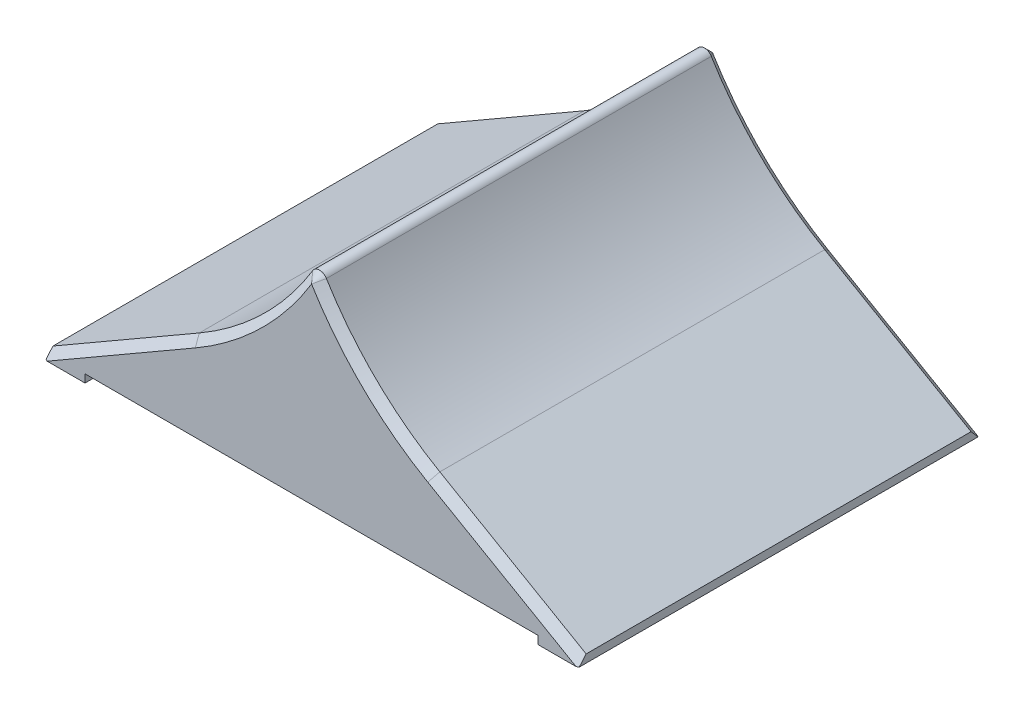
ISO-10303-21;
HEADER;
FILE_DESCRIPTION(('STEP AP214'),'2;1');
FILE_NAME('part.step','',(''),(''),'','','');
FILE_SCHEMA(('AUTOMOTIVE_DESIGN { 1 0 10303 214 1 1 1 1 }'));
ENDSEC;
DATA;
#1=APPLICATION_CONTEXT('core data for automotive mechanical design processes');
#2=APPLICATION_PROTOCOL_DEFINITION('international standard','automotive_design',2000,#1);
#3=PRODUCT_CONTEXT('',#1,'mechanical');
#4=PRODUCT('Part','Part','',(#3));
#5=PRODUCT_RELATED_PRODUCT_CATEGORY('part','',(#4));
#6=PRODUCT_DEFINITION_FORMATION('','',#4);
#7=PRODUCT_DEFINITION_CONTEXT('part definition',#1,'design');
#8=PRODUCT_DEFINITION('design','',#6,#7);
#9=PRODUCT_DEFINITION_SHAPE('','',#8);
#10=(LENGTH_UNIT() NAMED_UNIT(*) SI_UNIT(.MILLI.,.METRE.));
#11=(NAMED_UNIT(*) PLANE_ANGLE_UNIT() SI_UNIT($,.RADIAN.));
#12=(NAMED_UNIT(*) SI_UNIT($,.STERADIAN.) SOLID_ANGLE_UNIT());
#13=UNCERTAINTY_MEASURE_WITH_UNIT(LENGTH_MEASURE(1.E-05),#10,'distance_accuracy_value','');
#14=(GEOMETRIC_REPRESENTATION_CONTEXT(3) GLOBAL_UNCERTAINTY_ASSIGNED_CONTEXT((#13)) GLOBAL_UNIT_ASSIGNED_CONTEXT((#10,
#11,#12)) REPRESENTATION_CONTEXT('',''));
#15=CARTESIAN_POINT('',(0.,0.,0.));
#16=DIRECTION('',(0.,0.,1.));
#17=DIRECTION('',(1.,0.,0.));
#18=AXIS2_PLACEMENT_3D('',#15,#16,#17);
#19=CARTESIAN_POINT('',(-33.25,1.,-95.9820840390313));
#20=DIRECTION('',(0.,-1.,0.));
#21=DIRECTION('',(0.,0.,-1.));
#22=AXIS2_PLACEMENT_3D('',#19,#20,#21);
#23=PLANE('',#22);
#24=DIRECTION('',(-1.,0.,0.));
#25=VECTOR('',#24,1.);
#26=CARTESIAN_POINT('',(-33.25,1.,-25.));
#27=LINE('',#26,#25);
#28=CARTESIAN_POINT('',(28.25,1.,-25.));
#29=VERTEX_POINT('',#28);
#30=CARTESIAN_POINT('',(-28.25,1.,-25.));
#31=VERTEX_POINT('',#30);
#32=EDGE_CURVE('E206',#29,#31,#27,.T.);
#33=ORIENTED_EDGE('',*,*,#32,.F.);
#34=DIRECTION('',(0.,0.,1.));
#35=VECTOR('',#34,1.);
#36=CARTESIAN_POINT('',(28.25,1.,-25.));
#37=LINE('',#36,#35);
#38=CARTESIAN_POINT('',(28.25,1.,-15.));
#39=VERTEX_POINT('',#38);
#40=EDGE_CURVE('E216',#29,#39,#37,.T.);
#41=ORIENTED_EDGE('',*,*,#40,.T.);
#42=DIRECTION('',(0.707106781186548,0.,0.707106781186548));
#43=VECTOR('',#42,1.);
#44=CARTESIAN_POINT('',(28.25,1.,-15.));
#45=LINE('',#44,#43);
#46=CARTESIAN_POINT('',(31.25,1.,-12.));
#47=VERTEX_POINT('',#46);
#48=EDGE_CURVE('E222',#39,#47,#45,.T.);
#49=ORIENTED_EDGE('',*,*,#48,.T.);
#50=DIRECTION('',(0.,0.,1.));
#51=VECTOR('',#50,1.);
#52=CARTESIAN_POINT('',(31.25,1.,-12.));
#53=LINE('',#52,#51);
#54=CARTESIAN_POINT('',(31.25,1.,12.));
#55=VERTEX_POINT('',#54);
#56=EDGE_CURVE('E442',#47,#55,#53,.T.);
#57=ORIENTED_EDGE('',*,*,#56,.T.);
#58=DIRECTION('',(-0.707106781186548,0.,0.707106781186548));
#59=VECTOR('',#58,1.);
#60=CARTESIAN_POINT('',(31.25,1.,12.));
#61=LINE('',#60,#59);
#62=CARTESIAN_POINT('',(28.25,1.,15.));
#63=VERTEX_POINT('',#62);
#64=EDGE_CURVE('E439',#55,#63,#61,.T.);
#65=ORIENTED_EDGE('',*,*,#64,.T.);
#66=DIRECTION('',(0.,0.,1.));
#67=VECTOR('',#66,1.);
#68=CARTESIAN_POINT('',(28.25,1.,15.));
#69=LINE('',#68,#67);
#70=CARTESIAN_POINT('',(28.25,1.,25.));
#71=VERTEX_POINT('',#70);
#72=EDGE_CURVE('E421',#63,#71,#69,.T.);
#73=ORIENTED_EDGE('',*,*,#72,.T.);
#74=DIRECTION('',(1.,0.,0.));
#75=VECTOR('',#74,1.);
#76=CARTESIAN_POINT('',(-33.25,1.,25.));
#77=LINE('',#76,#75);
#78=CARTESIAN_POINT('',(-28.25,1.,25.));
#79=VERTEX_POINT('',#78);
#80=EDGE_CURVE('E212',#79,#71,#77,.T.);
#81=ORIENTED_EDGE('',*,*,#80,.F.);
#82=DIRECTION('',(0.,0.,-1.));
#83=VECTOR('',#82,1.);
#84=CARTESIAN_POINT('',(-28.25,1.,15.));
#85=LINE('',#84,#83);
#86=CARTESIAN_POINT('',(-28.25,1.,15.));
#87=VERTEX_POINT('',#86);
#88=EDGE_CURVE('E245',#79,#87,#85,.T.);
#89=ORIENTED_EDGE('',*,*,#88,.T.);
#90=DIRECTION('',(-0.707106781186548,0.,-0.707106781186548));
#91=VECTOR('',#90,1.);
#92=CARTESIAN_POINT('',(-31.25,1.,12.));
#93=LINE('',#92,#91);
#94=CARTESIAN_POINT('',(-31.25,1.,12.));
#95=VERTEX_POINT('',#94);
#96=EDGE_CURVE('E249',#87,#95,#93,.T.);
#97=ORIENTED_EDGE('',*,*,#96,.T.);
#98=DIRECTION('',(0.,0.,-1.));
#99=VECTOR('',#98,1.);
#100=CARTESIAN_POINT('',(-31.25,1.,-12.));
#101=LINE('',#100,#99);
#102=CARTESIAN_POINT('',(-31.25,1.,-12.));
#103=VERTEX_POINT('',#102);
#104=EDGE_CURVE('E252',#95,#103,#101,.T.);
#105=ORIENTED_EDGE('',*,*,#104,.T.);
#106=DIRECTION('',(0.707106781186548,0.,-0.707106781186548));
#107=VECTOR('',#106,1.);
#108=CARTESIAN_POINT('',(-28.25,1.,-15.));
#109=LINE('',#108,#107);
#110=CARTESIAN_POINT('',(-28.25,1.,-15.));
#111=VERTEX_POINT('',#110);
#112=EDGE_CURVE('E255',#103,#111,#109,.T.);
#113=ORIENTED_EDGE('',*,*,#112,.T.);
#114=DIRECTION('',(0.,0.,-1.));
#115=VECTOR('',#114,1.);
#116=CARTESIAN_POINT('',(-28.25,1.,-25.));
#117=LINE('',#116,#115);
#118=EDGE_CURVE('E228',#111,#31,#117,.T.);
#119=ORIENTED_EDGE('',*,*,#118,.T.);
#120=EDGE_LOOP('',(#33,#41,#49,#57,#65,#73,#81,#89,#97,#105,#113,#119));
#121=FACE_BOUND('',#120,.T.);
#122=ADVANCED_FACE('F35',(#121),#23,.T.);
#123=CARTESIAN_POINT('',(-33.25,1.,-25.));
#124=DIRECTION('',(0.,0.,1.));
#125=DIRECTION('',(1.,0.,0.));
#126=AXIS2_PLACEMENT_3D('',#123,#124,#125);
#127=PLANE('',#126);
#128=CARTESIAN_POINT('',(35.0000000000001,46.1776585640883,-25.));
#129=DIRECTION('',(0.,0.,1.));
#130=DIRECTION('',(1.,0.,0.));
#131=AXIS2_PLACEMENT_3D('',#128,#129,#130);
#132=CIRCLE('',#131,41.0000000000001);
#133=CARTESIAN_POINT('',(0.,24.8235020600258,-25.));
#134=VERTEX_POINT('',#133);
#135=CARTESIAN_POINT('',(14.5,10.6706170089263,-25.));
#136=VERTEX_POINT('',#135);
#137=EDGE_CURVE('E45',#134,#136,#132,.T.);
#138=ORIENTED_EDGE('',*,*,#137,.T.);
#139=DIRECTION('',(0.866025403784438,-0.500000000000002,0.));
#140=VECTOR('',#139,1.);
#141=CARTESIAN_POINT('',(32.75,0.133974596215555,-25.));
#142=LINE('',#141,#140);
#143=CARTESIAN_POINT('',(32.9820508075689,0.,-25.));
#144=VERTEX_POINT('',#143);
#145=EDGE_CURVE('E11',#136,#144,#142,.T.);
#146=ORIENTED_EDGE('',*,*,#145,.T.);
#147=DIRECTION('',(-1.,0.,0.));
#148=VECTOR('',#147,1.);
#149=CARTESIAN_POINT('',(33.25,0.,-25.));
#150=LINE('',#149,#148);
#151=CARTESIAN_POINT('',(28.25,0.,-25.));
#152=VERTEX_POINT('',#151);
#153=EDGE_CURVE('E209',#144,#152,#150,.T.);
#154=ORIENTED_EDGE('',*,*,#153,.T.);
#155=DIRECTION('',(0.,-1.,0.));
#156=VECTOR('',#155,1.);
#157=CARTESIAN_POINT('',(28.25,1.,-25.));
#158=LINE('',#157,#156);
#159=EDGE_CURVE('E201',#29,#152,#158,.T.);
#160=ORIENTED_EDGE('',*,*,#159,.F.);
#161=ORIENTED_EDGE('',*,*,#32,.T.);
#162=DIRECTION('',(0.,-1.,0.));
#163=VECTOR('',#162,1.);
#164=CARTESIAN_POINT('',(-28.25,1.,-25.));
#165=LINE('',#164,#163);
#166=CARTESIAN_POINT('',(-28.25,0.,-25.));
#167=VERTEX_POINT('',#166);
#168=EDGE_CURVE('E257',#31,#167,#165,.T.);
#169=ORIENTED_EDGE('',*,*,#168,.T.);
#170=DIRECTION('',(-1.,0.,0.));
#171=VECTOR('',#170,1.);
#172=CARTESIAN_POINT('',(-33.25,0.,-25.));
#173=LINE('',#172,#171);
#174=CARTESIAN_POINT('',(-32.9820508075689,0.,-25.));
#175=VERTEX_POINT('',#174);
#176=EDGE_CURVE('E229',#167,#175,#173,.T.);
#177=ORIENTED_EDGE('',*,*,#176,.T.);
#178=DIRECTION('',(0.866025403784438,0.500000000000001,0.));
#179=VECTOR('',#178,1.);
#180=CARTESIAN_POINT('',(-14.5,10.6706170089263,-25.));
#181=LINE('',#180,#179);
#182=CARTESIAN_POINT('',(-14.5,10.6706170089263,-25.));
#183=VERTEX_POINT('',#182);
#184=EDGE_CURVE('E334',#175,#183,#181,.T.);
#185=ORIENTED_EDGE('',*,*,#184,.T.);
#186=CARTESIAN_POINT('',(-35.0000000000001,46.1776585640882,-25.));
#187=DIRECTION('',(0.,0.,1.));
#188=DIRECTION('',(1.,0.,0.));
#189=AXIS2_PLACEMENT_3D('',#186,#187,#188);
#190=CIRCLE('',#189,41.);
#191=EDGE_CURVE('E56',#183,#134,#190,.T.);
#192=ORIENTED_EDGE('',*,*,#191,.T.);
#193=EDGE_LOOP('',(#138,#146,#154,#160,#161,#169,#177,#185,#192));
#194=FACE_BOUND('',#193,.T.);
#195=ADVANCED_FACE('F203',(#194),#127,.F.);
#196=CARTESIAN_POINT('',(-33.25,1.,25.));
#197=DIRECTION('',(1.,0.,0.));
#198=DIRECTION('',(0.,0.,-1.));
#199=AXIS2_PLACEMENT_3D('',#196,#197,#198);
#200=PLANE('',#199);
#201=DIRECTION('',(0.,0.,1.));
#202=VECTOR('',#201,1.);
#203=CARTESIAN_POINT('',(-33.25,0.,25.));
#204=LINE('',#203,#202);
#205=CARTESIAN_POINT('',(-33.25,0.,-24.8660254037844));
#206=VERTEX_POINT('',#205);
#207=CARTESIAN_POINT('',(-33.25,0.,24.8660254037844));
#208=VERTEX_POINT('',#207);
#209=EDGE_CURVE('E233',#206,#208,#204,.T.);
#210=ORIENTED_EDGE('',*,*,#209,.T.);
#211=DIRECTION('',(0.,0.755928946018452,-0.65465367070798));
#212=VECTOR('',#211,1.);
#213=CARTESIAN_POINT('',(-33.25,1.24743582965268,23.7857142857143));
#214=LINE('',#213,#212);
#215=CARTESIAN_POINT('',(-33.25,1.,24.));
#216=VERTEX_POINT('',#215);
#217=EDGE_CURVE('E323',#208,#216,#214,.T.);
#218=ORIENTED_EDGE('',*,*,#217,.T.);
#219=DIRECTION('',(0.,0.,1.));
#220=VECTOR('',#219,1.);
#221=CARTESIAN_POINT('',(-33.25,1.,25.));
#222=LINE('',#221,#220);
#223=CARTESIAN_POINT('',(-33.25,1.,-24.));
#224=VERTEX_POINT('',#223);
#225=EDGE_CURVE('E242',#224,#216,#222,.T.);
#226=ORIENTED_EDGE('',*,*,#225,.F.);
#227=DIRECTION('',(0.,-0.755928946018451,-0.654653670707981));
#228=VECTOR('',#227,1.);
#229=CARTESIAN_POINT('',(-33.25,0.0102566813892004,-24.8571428571429));
#230=LINE('',#229,#228);
#231=EDGE_CURVE('E321',#224,#206,#230,.T.);
#232=ORIENTED_EDGE('',*,*,#231,.T.);
#233=EDGE_LOOP('',(#210,#218,#226,#232));
#234=FACE_BOUND('',#233,.T.);
#235=ADVANCED_FACE('F375',(#234),#200,.F.);
#236=CARTESIAN_POINT('',(-28.25,1.,25.));
#237=DIRECTION('',(0.,0.,-1.));
#238=DIRECTION('',(-1.,0.,0.));
#239=AXIS2_PLACEMENT_3D('',#236,#237,#238);
#240=PLANE('',#239);
#241=DIRECTION('',(1.,0.,0.));
#242=VECTOR('',#241,1.);
#243=CARTESIAN_POINT('',(28.25,0.,25.));
#244=LINE('',#243,#242);
#245=CARTESIAN_POINT('',(28.25,0.,25.));
#246=VERTEX_POINT('',#245);
#247=CARTESIAN_POINT('',(32.9820508075688,0.,25.));
#248=VERTEX_POINT('',#247);
#249=EDGE_CURVE('E223',#246,#248,#244,.T.);
#250=ORIENTED_EDGE('',*,*,#249,.T.);
#251=DIRECTION('',(-0.866025403784438,0.500000000000002,0.));
#252=VECTOR('',#251,1.);
#253=CARTESIAN_POINT('',(14.5,10.6706170089263,25.));
#254=LINE('',#253,#252);
#255=CARTESIAN_POINT('',(14.5,10.6706170089263,25.));
#256=VERTEX_POINT('',#255);
#257=EDGE_CURVE('E294',#248,#256,#254,.T.);
#258=ORIENTED_EDGE('',*,*,#257,.T.);
#259=CARTESIAN_POINT('',(35.0000000000001,46.1776585640883,25.));
#260=DIRECTION('',(0.,0.,-1.));
#261=DIRECTION('',(-1.,0.,0.));
#262=AXIS2_PLACEMENT_3D('',#259,#260,#261);
#263=CIRCLE('',#262,41.0000000000001);
#264=CARTESIAN_POINT('',(0.,24.8235020600258,25.));
#265=VERTEX_POINT('',#264);
#266=EDGE_CURVE('E292',#256,#265,#263,.T.);
#267=ORIENTED_EDGE('',*,*,#266,.T.);
#268=CARTESIAN_POINT('',(-35.0000000000001,46.1776585640882,25.));
#269=DIRECTION('',(0.,0.,-1.));
#270=DIRECTION('',(-1.,0.,0.));
#271=AXIS2_PLACEMENT_3D('',#268,#269,#270);
#272=CIRCLE('',#271,41.);
#273=CARTESIAN_POINT('',(-14.5,10.6706170089263,25.));
#274=VERTEX_POINT('',#273);
#275=EDGE_CURVE('E288',#265,#274,#272,.T.);
#276=ORIENTED_EDGE('',*,*,#275,.T.);
#277=DIRECTION('',(-0.866025403784438,-0.500000000000001,0.));
#278=VECTOR('',#277,1.);
#279=CARTESIAN_POINT('',(-32.75,0.13397459621555,25.));
#280=LINE('',#279,#278);
#281=CARTESIAN_POINT('',(-32.9820508075688,0.,25.));
#282=VERTEX_POINT('',#281);
#283=EDGE_CURVE('E290',#274,#282,#280,.T.);
#284=ORIENTED_EDGE('',*,*,#283,.T.);
#285=DIRECTION('',(1.,0.,0.));
#286=VECTOR('',#285,1.);
#287=CARTESIAN_POINT('',(-28.25,0.,25.));
#288=LINE('',#287,#286);
#289=CARTESIAN_POINT('',(-28.25,0.,25.));
#290=VERTEX_POINT('',#289);
#291=EDGE_CURVE('E261',#282,#290,#288,.T.);
#292=ORIENTED_EDGE('',*,*,#291,.T.);
#293=DIRECTION('',(0.,-1.,0.));
#294=VECTOR('',#293,1.);
#295=CARTESIAN_POINT('',(-28.25,1.,25.));
#296=LINE('',#295,#294);
#297=EDGE_CURVE('E285',#79,#290,#296,.T.);
#298=ORIENTED_EDGE('',*,*,#297,.F.);
#299=ORIENTED_EDGE('',*,*,#80,.T.);
#300=DIRECTION('',(0.,-1.,0.));
#301=VECTOR('',#300,1.);
#302=CARTESIAN_POINT('',(28.25,1.,25.));
#303=LINE('',#302,#301);
#304=EDGE_CURVE('E419',#71,#246,#303,.T.);
#305=ORIENTED_EDGE('',*,*,#304,.T.);
#306=EDGE_LOOP('',(#250,#258,#267,#276,#284,#292,#298,#299,#305));
#307=FACE_BOUND('',#306,.T.);
#308=ADVANCED_FACE('F461',(#307),#240,.F.);
#309=CARTESIAN_POINT('',(-28.25,1.,15.));
#310=DIRECTION('',(-1.,0.,0.));
#311=DIRECTION('',(0.,0.,1.));
#312=AXIS2_PLACEMENT_3D('',#309,#310,#311);
#313=PLANE('',#312);
#314=DIRECTION('',(0.,0.,-1.));
#315=VECTOR('',#314,1.);
#316=CARTESIAN_POINT('',(-28.25,0.,15.));
#317=LINE('',#316,#315);
#318=CARTESIAN_POINT('',(-28.25,0.,15.));
#319=VERTEX_POINT('',#318);
#320=EDGE_CURVE('E263',#290,#319,#317,.T.);
#321=ORIENTED_EDGE('',*,*,#320,.T.);
#322=DIRECTION('',(0.,-1.,0.));
#323=VECTOR('',#322,1.);
#324=CARTESIAN_POINT('',(-28.25,1.,15.));
#325=LINE('',#324,#323);
#326=EDGE_CURVE('E282',#87,#319,#325,.T.);
#327=ORIENTED_EDGE('',*,*,#326,.F.);
#328=ORIENTED_EDGE('',*,*,#88,.F.);
#329=ORIENTED_EDGE('',*,*,#297,.T.);
#330=EDGE_LOOP('',(#321,#327,#328,#329));
#331=FACE_BOUND('',#330,.T.);
#332=ADVANCED_FACE('F532',(#331),#313,.F.);
#333=CARTESIAN_POINT('',(-31.25,1.,12.));
#334=DIRECTION('',(-0.707106781186547,0.,0.707106781186547));
#335=DIRECTION('',(0.707106781186548,0.,0.707106781186548));
#336=AXIS2_PLACEMENT_3D('',#333,#334,#335);
#337=PLANE('',#336);
#338=DIRECTION('',(-0.707106781186548,0.,-0.707106781186548));
#339=VECTOR('',#338,1.);
#340=CARTESIAN_POINT('',(-31.25,0.,12.));
#341=LINE('',#340,#339);
#342=CARTESIAN_POINT('',(-31.25,0.,12.));
#343=VERTEX_POINT('',#342);
#344=EDGE_CURVE('E265',#319,#343,#341,.T.);
#345=ORIENTED_EDGE('',*,*,#344,.T.);
#346=DIRECTION('',(0.,-1.,0.));
#347=VECTOR('',#346,1.);
#348=CARTESIAN_POINT('',(-31.25,1.,12.));
#349=LINE('',#348,#347);
#350=EDGE_CURVE('E279',#95,#343,#349,.T.);
#351=ORIENTED_EDGE('',*,*,#350,.F.);
#352=ORIENTED_EDGE('',*,*,#96,.F.);
#353=ORIENTED_EDGE('',*,*,#326,.T.);
#354=EDGE_LOOP('',(#345,#351,#352,#353));
#355=FACE_BOUND('',#354,.T.);
#356=ADVANCED_FACE('F528',(#355),#337,.F.);
#357=CARTESIAN_POINT('',(-31.25,1.,-12.));
#358=DIRECTION('',(-1.,0.,0.));
#359=DIRECTION('',(0.,0.,1.));
#360=AXIS2_PLACEMENT_3D('',#357,#358,#359);
#361=PLANE('',#360);
#362=DIRECTION('',(0.,0.,-1.));
#363=VECTOR('',#362,1.);
#364=CARTESIAN_POINT('',(-31.25,0.,-12.));
#365=LINE('',#364,#363);
#366=CARTESIAN_POINT('',(-31.25,0.,-12.));
#367=VERTEX_POINT('',#366);
#368=EDGE_CURVE('E267',#343,#367,#365,.T.);
#369=ORIENTED_EDGE('',*,*,#368,.T.);
#370=DIRECTION('',(0.,-1.,0.));
#371=VECTOR('',#370,1.);
#372=CARTESIAN_POINT('',(-31.25,1.,-12.));
#373=LINE('',#372,#371);
#374=EDGE_CURVE('E276',#103,#367,#373,.T.);
#375=ORIENTED_EDGE('',*,*,#374,.F.);
#376=ORIENTED_EDGE('',*,*,#104,.F.);
#377=ORIENTED_EDGE('',*,*,#350,.T.);
#378=EDGE_LOOP('',(#369,#375,#376,#377));
#379=FACE_BOUND('',#378,.T.);
#380=ADVANCED_FACE('F524',(#379),#361,.F.);
#381=CARTESIAN_POINT('',(-28.25,1.,-15.));
#382=DIRECTION('',(-0.707106781186547,0.,-0.707106781186547));
#383=DIRECTION('',(-0.707106781186548,0.,0.707106781186548));
#384=AXIS2_PLACEMENT_3D('',#381,#382,#383);
#385=PLANE('',#384);
#386=DIRECTION('',(0.707106781186548,0.,-0.707106781186548));
#387=VECTOR('',#386,1.);
#388=CARTESIAN_POINT('',(-28.25,0.,-15.));
#389=LINE('',#388,#387);
#390=CARTESIAN_POINT('',(-28.25,0.,-15.));
#391=VERTEX_POINT('',#390);
#392=EDGE_CURVE('E269',#367,#391,#389,.T.);
#393=ORIENTED_EDGE('',*,*,#392,.T.);
#394=DIRECTION('',(0.,-1.,0.));
#395=VECTOR('',#394,1.);
#396=CARTESIAN_POINT('',(-28.25,1.,-15.));
#397=LINE('',#396,#395);
#398=EDGE_CURVE('E273',#111,#391,#397,.T.);
#399=ORIENTED_EDGE('',*,*,#398,.F.);
#400=ORIENTED_EDGE('',*,*,#112,.F.);
#401=ORIENTED_EDGE('',*,*,#374,.T.);
#402=EDGE_LOOP('',(#393,#399,#400,#401));
#403=FACE_BOUND('',#402,.T.);
#404=ADVANCED_FACE('F520',(#403),#385,.F.);
#405=CARTESIAN_POINT('',(-28.25,1.,-25.));
#406=DIRECTION('',(-1.,0.,0.));
#407=DIRECTION('',(0.,0.,1.));
#408=AXIS2_PLACEMENT_3D('',#405,#406,#407);
#409=PLANE('',#408);
#410=DIRECTION('',(0.,0.,-1.));
#411=VECTOR('',#410,1.);
#412=CARTESIAN_POINT('',(-28.25,0.,-25.));
#413=LINE('',#412,#411);
#414=EDGE_CURVE('E246',#391,#167,#413,.T.);
#415=ORIENTED_EDGE('',*,*,#414,.T.);
#416=ORIENTED_EDGE('',*,*,#168,.F.);
#417=ORIENTED_EDGE('',*,*,#118,.F.);
#418=ORIENTED_EDGE('',*,*,#398,.T.);
#419=EDGE_LOOP('',(#415,#416,#417,#418));
#420=FACE_BOUND('',#419,.T.);
#421=ADVANCED_FACE('F516',(#420),#409,.F.);
#422=CARTESIAN_POINT('',(0.,0.,0.));
#423=DIRECTION('',(0.,-1.,0.));
#424=DIRECTION('',(0.,0.,-1.));
#425=AXIS2_PLACEMENT_3D('',#422,#423,#424);
#426=PLANE('',#425);
#427=ORIENTED_EDGE('',*,*,#291,.F.);
#428=DIRECTION('',(-0.894427190999914,0.,-0.447213595499961));
#429=VECTOR('',#428,1.);
#430=CARTESIAN_POINT('',(-16.5964101615139,0.,33.1928203230275));
#431=LINE('',#430,#429);
#432=EDGE_CURVE('E319',#282,#208,#431,.T.);
#433=ORIENTED_EDGE('',*,*,#432,.T.);
#434=ORIENTED_EDGE('',*,*,#209,.F.);
#435=DIRECTION('',(0.894427190999913,0.,-0.447213595499963));
#436=VECTOR('',#435,1.);
#437=CARTESIAN_POINT('',(-16.596410161514,0.,-33.1928203230275));
#438=LINE('',#437,#436);
#439=EDGE_CURVE('E317',#206,#175,#438,.T.);
#440=ORIENTED_EDGE('',*,*,#439,.T.);
#441=ORIENTED_EDGE('',*,*,#176,.F.);
#442=ORIENTED_EDGE('',*,*,#414,.F.);
#443=ORIENTED_EDGE('',*,*,#392,.F.);
#444=ORIENTED_EDGE('',*,*,#368,.F.);
#445=ORIENTED_EDGE('',*,*,#344,.F.);
#446=ORIENTED_EDGE('',*,*,#320,.F.);
#447=EDGE_LOOP('',(#427,#433,#434,#440,#441,#442,#443,#444,#445,#446));
#448=FACE_BOUND('',#447,.T.);
#449=ADVANCED_FACE('F513',(#448),#426,.T.);
#450=CARTESIAN_POINT('',(-33.25,1.,-95.9820840390313));
#451=DIRECTION('',(-0.500000000000001,0.866025403784438,0.));
#452=DIRECTION('',(-0.866025403784438,-0.500000000000001,0.));
#453=AXIS2_PLACEMENT_3D('',#450,#451,#452);
#454=PLANE('',#453);
#455=ORIENTED_EDGE('',*,*,#225,.T.);
#456=DIRECTION('',(0.866025403784438,0.500000000000001,0.));
#457=VECTOR('',#456,1.);
#458=CARTESIAN_POINT('',(-15.,11.5366424127107,24.));
#459=LINE('',#458,#457);
#460=CARTESIAN_POINT('',(-15.,11.5366424127107,24.));
#461=VERTEX_POINT('',#460);
#462=EDGE_CURVE('E327',#216,#461,#459,.T.);
#463=ORIENTED_EDGE('',*,*,#462,.T.);
#464=DIRECTION('',(0.,0.,1.));
#465=VECTOR('',#464,1.);
#466=CARTESIAN_POINT('',(-15.,11.5366424127107,-95.9820840390313));
#467=LINE('',#466,#465);
#468=CARTESIAN_POINT('',(-15.,11.5366424127107,-24.));
#469=VERTEX_POINT('',#468);
#470=EDGE_CURVE('E230',#469,#461,#467,.T.);
#471=ORIENTED_EDGE('',*,*,#470,.F.);
#472=DIRECTION('',(-0.866025403784438,-0.500000000000001,0.));
#473=VECTOR('',#472,1.);
#474=CARTESIAN_POINT('',(-33.25,1.,-24.));
#475=LINE('',#474,#473);
#476=EDGE_CURVE('E325',#469,#224,#475,.T.);
#477=ORIENTED_EDGE('',*,*,#476,.T.);
#478=EDGE_LOOP('',(#455,#463,#471,#477));
#479=FACE_BOUND('',#478,.T.);
#480=ADVANCED_FACE('F372',(#479),#454,.T.);
#481=CARTESIAN_POINT('',(-35.0000000000001,46.1776585640882,-95.9820840390313));
#482=DIRECTION('',(0.,0.,1.));
#483=DIRECTION('',(1.,0.,0.));
#484=AXIS2_PLACEMENT_3D('',#481,#482,#483);
#485=CYLINDRICAL_SURFACE('',#484,40.);
#486=ORIENTED_EDGE('',*,*,#470,.T.);
#487=CARTESIAN_POINT('',(-35.0000000000001,46.1776585640882,24.));
#488=DIRECTION('',(0.,0.,-1.));
#489=DIRECTION('',(-1.,0.,0.));
#490=AXIS2_PLACEMENT_3D('',#487,#488,#489);
#491=CIRCLE('',#490,40.);
#492=CARTESIAN_POINT('',(-0.853658536585353,25.3443351454908,24.));
#493=VERTEX_POINT('',#492);
#494=EDGE_CURVE('E331',#461,#493,#491,.F.);
#495=ORIENTED_EDGE('',*,*,#494,.T.);
#496=DIRECTION('',(0.,0.,1.));
#497=VECTOR('',#496,1.);
#498=CARTESIAN_POINT('',(-0.853658536585353,25.3443351454908,-95.9820840390313));
#499=LINE('',#498,#497);
#500=CARTESIAN_POINT('',(-0.853658536585353,25.3443351454908,-24.));
#501=VERTEX_POINT('',#500);
#502=EDGE_CURVE('E236',#501,#493,#499,.T.);
#503=ORIENTED_EDGE('',*,*,#502,.F.);
#504=CARTESIAN_POINT('',(-35.0000000000001,46.1776585640882,-24.));
#505=DIRECTION('',(0.,0.,1.));
#506=DIRECTION('',(1.,0.,0.));
#507=AXIS2_PLACEMENT_3D('',#504,#505,#506);
#508=CIRCLE('',#507,40.);
#509=EDGE_CURVE('E329',#501,#469,#508,.F.);
#510=ORIENTED_EDGE('',*,*,#509,.T.);
#511=EDGE_LOOP('',(#486,#495,#503,#510));
#512=FACE_BOUND('',#511,.T.);
#513=ADVANCED_FACE('F385',(#512),#485,.F.);
#514=CARTESIAN_POINT('',(0.,24.8235020600258,-95.9820840390313));
#515=DIRECTION('',(0.,0.,1.));
#516=DIRECTION('',(1.,0.,0.));
#517=AXIS2_PLACEMENT_3D('',#514,#515,#516);
#518=CYLINDRICAL_SURFACE('',#517,1.);
#519=ORIENTED_EDGE('',*,*,#502,.T.);
#520=CARTESIAN_POINT('',(0.,24.8235020600258,24.));
#521=DIRECTION('',(0.,0.,-1.));
#522=DIRECTION('',(-1.,0.,0.));
#523=AXIS2_PLACEMENT_3D('',#520,#521,#522);
#524=CIRCLE('',#523,1.);
#525=CARTESIAN_POINT('',(0.85365853658536,25.3443351454907,24.));
#526=VERTEX_POINT('',#525);
#527=EDGE_CURVE('E315',#493,#526,#524,.T.);
#528=ORIENTED_EDGE('',*,*,#527,.T.);
#529=DIRECTION('',(0.,0.,1.));
#530=VECTOR('',#529,1.);
#531=CARTESIAN_POINT('',(0.85365853658536,25.3443351454907,-95.9820840390313));
#532=LINE('',#531,#530);
#533=CARTESIAN_POINT('',(0.85365853658536,25.3443351454907,-24.));
#534=VERTEX_POINT('',#533);
#535=EDGE_CURVE('E390',#534,#526,#532,.T.);
#536=ORIENTED_EDGE('',*,*,#535,.F.);
#537=CARTESIAN_POINT('',(0.,24.8235020600258,-24.));
#538=DIRECTION('',(0.,0.,1.));
#539=DIRECTION('',(1.,0.,0.));
#540=AXIS2_PLACEMENT_3D('',#537,#538,#539);
#541=CIRCLE('',#540,1.);
#542=EDGE_CURVE('E313',#534,#501,#541,.T.);
#543=ORIENTED_EDGE('',*,*,#542,.T.);
#544=EDGE_LOOP('',(#519,#528,#536,#543));
#545=FACE_BOUND('',#544,.T.);
#546=ADVANCED_FACE('F485',(#545),#518,.T.);
#547=CARTESIAN_POINT('',(35.0000000000001,46.1776585640883,-95.9820840390313));
#548=DIRECTION('',(0.,0.,1.));
#549=DIRECTION('',(1.,0.,0.));
#550=AXIS2_PLACEMENT_3D('',#547,#548,#549);
#551=CYLINDRICAL_SURFACE('',#550,40.);
#552=ORIENTED_EDGE('',*,*,#535,.T.);
#553=CARTESIAN_POINT('',(35.0000000000001,46.1776585640883,23.9999999999999));
#554=DIRECTION('',(0.,0.,-1.));
#555=DIRECTION('',(-1.,0.,0.));
#556=AXIS2_PLACEMENT_3D('',#553,#554,#555);
#557=CIRCLE('',#556,40.);
#558=CARTESIAN_POINT('',(15.,11.5366424127107,23.9999999999999));
#559=VERTEX_POINT('',#558);
#560=EDGE_CURVE('E311',#526,#559,#557,.F.);
#561=ORIENTED_EDGE('',*,*,#560,.T.);
#562=DIRECTION('',(0.,0.,1.));
#563=VECTOR('',#562,1.);
#564=CARTESIAN_POINT('',(15.,11.5366424127107,-95.9820840390313));
#565=LINE('',#564,#563);
#566=CARTESIAN_POINT('',(15.,11.5366424127107,-23.9999999999999));
#567=VERTEX_POINT('',#566);
#568=EDGE_CURVE('E393',#567,#559,#565,.T.);
#569=ORIENTED_EDGE('',*,*,#568,.F.);
#570=CARTESIAN_POINT('',(35.0000000000001,46.1776585640883,-23.9999999999999));
#571=DIRECTION('',(0.,0.,1.));
#572=DIRECTION('',(1.,0.,0.));
#573=AXIS2_PLACEMENT_3D('',#570,#571,#572);
#574=CIRCLE('',#573,40.);
#575=EDGE_CURVE('E309',#567,#534,#574,.F.);
#576=ORIENTED_EDGE('',*,*,#575,.T.);
#577=EDGE_LOOP('',(#552,#561,#569,#576));
#578=FACE_BOUND('',#577,.T.);
#579=ADVANCED_FACE('F482',(#578),#551,.F.);
#580=CARTESIAN_POINT('',(33.25,1.,-95.9820840390313));
#581=DIRECTION('',(0.500000000000002,0.866025403784438,0.));
#582=DIRECTION('',(-0.866025403784437,0.500000000000002,0.));
#583=AXIS2_PLACEMENT_3D('',#580,#581,#582);
#584=PLANE('',#583);
#585=ORIENTED_EDGE('',*,*,#568,.T.);
#586=DIRECTION('',(0.866025403784437,-0.500000000000002,0.));
#587=VECTOR('',#586,1.);
#588=CARTESIAN_POINT('',(33.25,0.999999999999999,23.9999999999999));
#589=LINE('',#588,#587);
#590=CARTESIAN_POINT('',(33.25,1.,24.));
#591=VERTEX_POINT('',#590);
#592=EDGE_CURVE('E299',#559,#591,#589,.T.);
#593=ORIENTED_EDGE('',*,*,#592,.T.);
#594=DIRECTION('',(0.,0.,1.));
#595=VECTOR('',#594,1.);
#596=CARTESIAN_POINT('',(33.25,1.,-95.9820840390313));
#597=LINE('',#596,#595);
#598=CARTESIAN_POINT('',(33.25,1.,-23.9999999999999));
#599=VERTEX_POINT('',#598);
#600=EDGE_CURVE('E240',#599,#591,#597,.T.);
#601=ORIENTED_EDGE('',*,*,#600,.F.);
#602=DIRECTION('',(-0.866025403784437,0.500000000000002,0.));
#603=VECTOR('',#602,1.);
#604=CARTESIAN_POINT('',(15.,11.5366424127107,-24.));
#605=LINE('',#604,#603);
#606=EDGE_CURVE('E297',#599,#567,#605,.T.);
#607=ORIENTED_EDGE('',*,*,#606,.T.);
#608=EDGE_LOOP('',(#585,#593,#601,#607));
#609=FACE_BOUND('',#608,.T.);
#610=ADVANCED_FACE('F495',(#609),#584,.T.);
#611=CARTESIAN_POINT('',(33.25,1.,25.));
#612=DIRECTION('',(-1.,0.,0.));
#613=DIRECTION('',(0.,0.,1.));
#614=AXIS2_PLACEMENT_3D('',#611,#612,#613);
#615=PLANE('',#614);
#616=ORIENTED_EDGE('',*,*,#600,.T.);
#617=DIRECTION('',(0.,-0.755928946018456,0.654653670707975));
#618=VECTOR('',#617,1.);
#619=CARTESIAN_POINT('',(33.25,15.2275602050301,11.6785714285714));
#620=LINE('',#619,#618);
#621=CARTESIAN_POINT('',(33.25,0.,24.8660254037844));
#622=VERTEX_POINT('',#621);
#623=EDGE_CURVE('E303',#591,#622,#620,.T.);
#624=ORIENTED_EDGE('',*,*,#623,.T.);
#625=DIRECTION('',(0.,0.,-1.));
#626=VECTOR('',#625,1.);
#627=CARTESIAN_POINT('',(33.25,0.,25.));
#628=LINE('',#627,#626);
#629=CARTESIAN_POINT('',(33.25,0.,-24.8660254037844));
#630=VERTEX_POINT('',#629);
#631=EDGE_CURVE('E348',#622,#630,#628,.T.);
#632=ORIENTED_EDGE('',*,*,#631,.T.);
#633=DIRECTION('',(0.,0.755928946018454,0.654653670707978));
#634=VECTOR('',#633,1.);
#635=CARTESIAN_POINT('',(33.25,16.4647393532935,-10.6071428571428));
#636=LINE('',#635,#634);
#637=EDGE_CURVE('E301',#630,#599,#636,.T.);
#638=ORIENTED_EDGE('',*,*,#637,.T.);
#639=EDGE_LOOP('',(#616,#624,#632,#638));
#640=FACE_BOUND('',#639,.T.);
#641=ADVANCED_FACE('F494',(#640),#615,.F.);
#642=CARTESIAN_POINT('',(28.25,1.,-25.));
#643=DIRECTION('',(1.,0.,0.));
#644=DIRECTION('',(0.,0.,-1.));
#645=AXIS2_PLACEMENT_3D('',#642,#643,#644);
#646=PLANE('',#645);
#647=DIRECTION('',(0.,0.,1.));
#648=VECTOR('',#647,1.);
#649=CARTESIAN_POINT('',(28.25,0.,-25.));
#650=LINE('',#649,#648);
#651=CARTESIAN_POINT('',(28.25,0.,-15.));
#652=VERTEX_POINT('',#651);
#653=EDGE_CURVE('E432',#152,#652,#650,.T.);
#654=ORIENTED_EDGE('',*,*,#653,.T.);
#655=DIRECTION('',(0.,-1.,0.));
#656=VECTOR('',#655,1.);
#657=CARTESIAN_POINT('',(28.25,1.,-15.));
#658=LINE('',#657,#656);
#659=EDGE_CURVE('E213',#39,#652,#658,.T.);
#660=ORIENTED_EDGE('',*,*,#659,.F.);
#661=ORIENTED_EDGE('',*,*,#40,.F.);
#662=ORIENTED_EDGE('',*,*,#159,.T.);
#663=EDGE_LOOP('',(#654,#660,#661,#662));
#664=FACE_BOUND('',#663,.T.);
#665=ADVANCED_FACE('F217',(#664),#646,.F.);
#666=CARTESIAN_POINT('',(28.25,1.,-15.));
#667=DIRECTION('',(0.707106781186547,0.,-0.707106781186547));
#668=DIRECTION('',(-0.707106781186548,0.,-0.707106781186548));
#669=AXIS2_PLACEMENT_3D('',#666,#667,#668);
#670=PLANE('',#669);
#671=DIRECTION('',(0.707106781186548,0.,0.707106781186548));
#672=VECTOR('',#671,1.);
#673=CARTESIAN_POINT('',(28.25,0.,-15.));
#674=LINE('',#673,#672);
#675=CARTESIAN_POINT('',(31.25,0.,-12.));
#676=VERTEX_POINT('',#675);
#677=EDGE_CURVE('E430',#652,#676,#674,.T.);
#678=ORIENTED_EDGE('',*,*,#677,.T.);
#679=DIRECTION('',(0.,-1.,0.));
#680=VECTOR('',#679,1.);
#681=CARTESIAN_POINT('',(31.25,1.,-12.));
#682=LINE('',#681,#680);
#683=EDGE_CURVE('E410',#47,#676,#682,.T.);
#684=ORIENTED_EDGE('',*,*,#683,.F.);
#685=ORIENTED_EDGE('',*,*,#48,.F.);
#686=ORIENTED_EDGE('',*,*,#659,.T.);
#687=EDGE_LOOP('',(#678,#684,#685,#686));
#688=FACE_BOUND('',#687,.T.);
#689=ADVANCED_FACE('F447',(#688),#670,.F.);
#690=CARTESIAN_POINT('',(31.25,1.,-12.));
#691=DIRECTION('',(1.,0.,0.));
#692=DIRECTION('',(0.,0.,-1.));
#693=AXIS2_PLACEMENT_3D('',#690,#691,#692);
#694=PLANE('',#693);
#695=DIRECTION('',(0.,0.,1.));
#696=VECTOR('',#695,1.);
#697=CARTESIAN_POINT('',(31.25,0.,-12.));
#698=LINE('',#697,#696);
#699=CARTESIAN_POINT('',(31.25,0.,12.));
#700=VERTEX_POINT('',#699);
#701=EDGE_CURVE('E428',#676,#700,#698,.T.);
#702=ORIENTED_EDGE('',*,*,#701,.T.);
#703=DIRECTION('',(0.,-1.,0.));
#704=VECTOR('',#703,1.);
#705=CARTESIAN_POINT('',(31.25,1.,12.));
#706=LINE('',#705,#704);
#707=EDGE_CURVE('E413',#55,#700,#706,.T.);
#708=ORIENTED_EDGE('',*,*,#707,.F.);
#709=ORIENTED_EDGE('',*,*,#56,.F.);
#710=ORIENTED_EDGE('',*,*,#683,.T.);
#711=EDGE_LOOP('',(#702,#708,#709,#710));
#712=FACE_BOUND('',#711,.T.);
#713=ADVANCED_FACE('F451',(#712),#694,.F.);
#714=CARTESIAN_POINT('',(31.25,1.,12.));
#715=DIRECTION('',(0.707106781186547,0.,0.707106781186547));
#716=DIRECTION('',(0.707106781186548,0.,-0.707106781186548));
#717=AXIS2_PLACEMENT_3D('',#714,#715,#716);
#718=PLANE('',#717);
#719=DIRECTION('',(-0.707106781186548,0.,0.707106781186548));
#720=VECTOR('',#719,1.);
#721=CARTESIAN_POINT('',(31.25,0.,12.));
#722=LINE('',#721,#720);
#723=CARTESIAN_POINT('',(28.25,0.,15.));
#724=VERTEX_POINT('',#723);
#725=EDGE_CURVE('E426',#700,#724,#722,.T.);
#726=ORIENTED_EDGE('',*,*,#725,.T.);
#727=DIRECTION('',(0.,-1.,0.));
#728=VECTOR('',#727,1.);
#729=CARTESIAN_POINT('',(28.25,1.,15.));
#730=LINE('',#729,#728);
#731=EDGE_CURVE('E416',#63,#724,#730,.T.);
#732=ORIENTED_EDGE('',*,*,#731,.F.);
#733=ORIENTED_EDGE('',*,*,#64,.F.);
#734=ORIENTED_EDGE('',*,*,#707,.T.);
#735=EDGE_LOOP('',(#726,#732,#733,#734));
#736=FACE_BOUND('',#735,.T.);
#737=ADVANCED_FACE('F455',(#736),#718,.F.);
#738=CARTESIAN_POINT('',(28.25,1.,15.));
#739=DIRECTION('',(1.,0.,0.));
#740=DIRECTION('',(0.,0.,-1.));
#741=AXIS2_PLACEMENT_3D('',#738,#739,#740);
#742=PLANE('',#741);
#743=DIRECTION('',(0.,0.,1.));
#744=VECTOR('',#743,1.);
#745=CARTESIAN_POINT('',(28.25,0.,15.));
#746=LINE('',#745,#744);
#747=EDGE_CURVE('E424',#724,#246,#746,.T.);
#748=ORIENTED_EDGE('',*,*,#747,.T.);
#749=ORIENTED_EDGE('',*,*,#304,.F.);
#750=ORIENTED_EDGE('',*,*,#72,.F.);
#751=ORIENTED_EDGE('',*,*,#731,.T.);
#752=EDGE_LOOP('',(#748,#749,#750,#751));
#753=FACE_BOUND('',#752,.T.);
#754=ADVANCED_FACE('F458',(#753),#742,.F.);
#755=CARTESIAN_POINT('',(0.,0.,0.));
#756=DIRECTION('',(0.,1.,0.));
#757=DIRECTION('',(0.,0.,1.));
#758=AXIS2_PLACEMENT_3D('',#755,#756,#757);
#759=PLANE('',#758);
#760=ORIENTED_EDGE('',*,*,#631,.F.);
#761=DIRECTION('',(-0.894427190999916,0.,0.447213595499958));
#762=VECTOR('',#761,1.);
#763=CARTESIAN_POINT('',(-4.10358983848616,0.,43.5428203230275));
#764=LINE('',#763,#762);
#765=EDGE_CURVE('E307',#622,#248,#764,.T.);
#766=ORIENTED_EDGE('',*,*,#765,.T.);
#767=ORIENTED_EDGE('',*,*,#249,.F.);
#768=ORIENTED_EDGE('',*,*,#747,.F.);
#769=ORIENTED_EDGE('',*,*,#725,.F.);
#770=ORIENTED_EDGE('',*,*,#701,.F.);
#771=ORIENTED_EDGE('',*,*,#677,.F.);
#772=ORIENTED_EDGE('',*,*,#653,.F.);
#773=ORIENTED_EDGE('',*,*,#153,.F.);
#774=DIRECTION('',(0.894427190999914,0.,0.447213595499961));
#775=VECTOR('',#774,1.);
#776=CARTESIAN_POINT('',(-7.10358983848601,0.,-45.0428203230276));
#777=LINE('',#776,#775);
#778=EDGE_CURVE('E305',#144,#630,#777,.T.);
#779=ORIENTED_EDGE('',*,*,#778,.T.);
#780=EDGE_LOOP('',(#760,#766,#767,#768,#769,#770,#771,#772,#773,#779));
#781=FACE_BOUND('',#780,.T.);
#782=ADVANCED_FACE('F465',(#781),#759,.F.);
#783=CARTESIAN_POINT('',(-29.,2.29903810567665,25.));
#784=DIRECTION('',(-0.353553390593276,0.612372435695797,0.707106781186545));
#785=DIRECTION('',(0.866025403784438,0.500000000000001,0.));
#786=AXIS2_PLACEMENT_3D('',#783,#784,#785);
#787=PLANE('',#786);
#788=ORIENTED_EDGE('',*,*,#432,.F.);
#789=ORIENTED_EDGE('',*,*,#283,.F.);
#790=DIRECTION('',(0.353553390593274,-0.61237243569579,0.707106781186552));
#791=VECTOR('',#790,1.);
#792=CARTESIAN_POINT('',(-15.,11.5366424127107,24.));
#793=LINE('',#792,#791);
#794=EDGE_CURVE('E345',#461,#274,#793,.T.);
#795=ORIENTED_EDGE('',*,*,#794,.F.);
#796=ORIENTED_EDGE('',*,*,#462,.F.);
#797=ORIENTED_EDGE('',*,*,#217,.F.);
#798=EDGE_LOOP('',(#788,#789,#795,#796,#797));
#799=FACE_BOUND('',#798,.T.);
#800=ADVANCED_FACE('F380',(#799),#787,.T.);
#801=CARTESIAN_POINT('',(-35.0000000000001,46.1776585640882,25.));
#802=DIRECTION('',(0.,0.,1.));
#803=DIRECTION('',(1.,0.,0.));
#804=AXIS2_PLACEMENT_3D('',#801,#802,#803);
#805=CONICAL_SURFACE('',#804,41.,0.785398163397448);
#806=DIRECTION('',(0.603627740037305,-0.368284606598571,0.707106781186541));
#807=VECTOR('',#806,1.);
#808=CARTESIAN_POINT('',(-0.853658536585353,25.3443351454908,24.));
#809=LINE('',#808,#807);
#810=EDGE_CURVE('E342',#493,#265,#809,.T.);
#811=ORIENTED_EDGE('',*,*,#810,.F.);
#812=ORIENTED_EDGE('',*,*,#494,.F.);
#813=ORIENTED_EDGE('',*,*,#794,.T.);
#814=ORIENTED_EDGE('',*,*,#275,.F.);
#815=EDGE_LOOP('',(#811,#812,#813,#814));
#816=FACE_BOUND('',#815,.T.);
#817=ADVANCED_FACE('F474',(#816),#805,.F.);
#818=CARTESIAN_POINT('',(0.,24.8235020600258,24.));
#819=DIRECTION('',(0.,0.,-1.));
#820=DIRECTION('',(-1.,0.,0.));
#821=AXIS2_PLACEMENT_3D('',#818,#819,#820);
#822=CONICAL_SURFACE('',#821,1.00000000000001,0.785398163397449);
#823=ORIENTED_EDGE('',*,*,#527,.F.);
#824=ORIENTED_EDGE('',*,*,#810,.T.);
#825=DIRECTION('',(-0.60362774003732,-0.368284606598585,0.707106781186521));
#826=VECTOR('',#825,1.);
#827=CARTESIAN_POINT('',(0.853658536585397,25.3443351454907,24.));
#828=LINE('',#827,#826);
#829=EDGE_CURVE('E339',#526,#265,#828,.T.);
#830=ORIENTED_EDGE('',*,*,#829,.F.);
#831=EDGE_LOOP('',(#823,#824,#830));
#832=FACE_BOUND('',#831,.T.);
#833=ADVANCED_FACE('F478',(#832),#822,.T.);
#834=CARTESIAN_POINT('',(35.0000000000001,46.1776585640883,25.));
#835=DIRECTION('',(0.,0.,1.));
#836=DIRECTION('',(1.,0.,0.));
#837=AXIS2_PLACEMENT_3D('',#834,#835,#836);
#838=CONICAL_SURFACE('',#837,41.0000000000001,0.785398163397448);
#839=ORIENTED_EDGE('',*,*,#829,.T.);
#840=ORIENTED_EDGE('',*,*,#266,.F.);
#841=DIRECTION('',(-0.353553390593281,-0.612372435695803,0.707106781186537));
#842=VECTOR('',#841,1.);
#843=CARTESIAN_POINT('',(15.,11.5366424127108,23.9999999999999));
#844=LINE('',#843,#842);
#845=EDGE_CURVE('E337',#559,#256,#844,.T.);
#846=ORIENTED_EDGE('',*,*,#845,.F.);
#847=ORIENTED_EDGE('',*,*,#560,.F.);
#848=EDGE_LOOP('',(#839,#840,#846,#847));
#849=FACE_BOUND('',#848,.T.);
#850=ADVANCED_FACE('F480',(#849),#838,.F.);
#851=CARTESIAN_POINT('',(-13.3749999999999,26.7642557625871,25.));
#852=DIRECTION('',(0.353553390593275,0.612372435695792,0.707106781186549));
#853=DIRECTION('',(0.866025403784437,-0.500000000000002,0.));
#854=AXIS2_PLACEMENT_3D('',#851,#852,#853);
#855=PLANE('',#854);
#856=ORIENTED_EDGE('',*,*,#623,.F.);
#857=ORIENTED_EDGE('',*,*,#592,.F.);
#858=ORIENTED_EDGE('',*,*,#845,.T.);
#859=ORIENTED_EDGE('',*,*,#257,.F.);
#860=ORIENTED_EDGE('',*,*,#765,.F.);
#861=EDGE_LOOP('',(#856,#857,#858,#859,#860));
#862=FACE_BOUND('',#861,.T.);
#863=ADVANCED_FACE('F468',(#862),#855,.T.);
#864=CARTESIAN_POINT('',(-32.75,0.133974596215552,-25.));
#865=DIRECTION('',(-0.353553390593276,0.612372435695798,-0.707106781186543));
#866=DIRECTION('',(-0.866025403784438,-0.500000000000001,0.));
#867=AXIS2_PLACEMENT_3D('',#864,#865,#866);
#868=PLANE('',#867);
#869=ORIENTED_EDGE('',*,*,#231,.F.);
#870=ORIENTED_EDGE('',*,*,#476,.F.);
#871=DIRECTION('',(-0.353553390593273,0.612372435695791,0.707106781186551));
#872=VECTOR('',#871,1.);
#873=CARTESIAN_POINT('',(-14.5,10.6706170089263,-25.));
#874=LINE('',#873,#872);
#875=EDGE_CURVE('E40',#183,#469,#874,.T.);
#876=ORIENTED_EDGE('',*,*,#875,.F.);
#877=ORIENTED_EDGE('',*,*,#184,.F.);
#878=ORIENTED_EDGE('',*,*,#439,.F.);
#879=EDGE_LOOP('',(#869,#870,#876,#877,#878));
#880=FACE_BOUND('',#879,.T.);
#881=ADVANCED_FACE('F38',(#880),#868,.T.);
#882=CARTESIAN_POINT('',(-35.0000000000001,46.1776585640882,-25.));
#883=DIRECTION('',(0.,0.,-1.));
#884=DIRECTION('',(-1.,0.,0.));
#885=AXIS2_PLACEMENT_3D('',#882,#883,#884);
#886=CONICAL_SURFACE('',#885,41.,0.785398163397438);
#887=ORIENTED_EDGE('',*,*,#875,.T.);
#888=ORIENTED_EDGE('',*,*,#509,.F.);
#889=DIRECTION('',(-0.603627740037293,0.368284606598566,0.707106781186554));
#890=VECTOR('',#889,1.);
#891=CARTESIAN_POINT('',(0.,24.8235020600258,-25.));
#892=LINE('',#891,#890);
#893=EDGE_CURVE('E354',#134,#501,#892,.T.);
#894=ORIENTED_EDGE('',*,*,#893,.F.);
#895=ORIENTED_EDGE('',*,*,#191,.F.);
#896=EDGE_LOOP('',(#887,#888,#894,#895));
#897=FACE_BOUND('',#896,.T.);
#898=ADVANCED_FACE('F363',(#897),#886,.F.);
#899=CARTESIAN_POINT('',(0.,24.8235020600258,-24.));
#900=DIRECTION('',(0.,0.,1.));
#901=DIRECTION('',(1.,0.,0.));
#902=AXIS2_PLACEMENT_3D('',#899,#900,#901);
#903=CONICAL_SURFACE('',#902,1.00000000000001,0.785398163397441);
#904=ORIENTED_EDGE('',*,*,#893,.T.);
#905=ORIENTED_EDGE('',*,*,#542,.F.);
#906=DIRECTION('',(0.603627740037306,0.368284606598578,0.707106781186536));
#907=VECTOR('',#906,1.);
#908=CARTESIAN_POINT('',(0.,24.8235020600258,-25.));
#909=LINE('',#908,#907);
#910=EDGE_CURVE('E352',#134,#534,#909,.T.);
#911=ORIENTED_EDGE('',*,*,#910,.F.);
#912=EDGE_LOOP('',(#904,#905,#911));
#913=FACE_BOUND('',#912,.T.);
#914=ADVANCED_FACE('F486',(#913),#903,.T.);
#915=CARTESIAN_POINT('',(35.0000000000001,46.1776585640883,-25.));
#916=DIRECTION('',(0.,0.,-1.));
#917=DIRECTION('',(-1.,0.,0.));
#918=AXIS2_PLACEMENT_3D('',#915,#916,#917);
#919=CONICAL_SURFACE('',#918,41.0000000000001,0.785398163397438);
#920=ORIENTED_EDGE('',*,*,#910,.T.);
#921=ORIENTED_EDGE('',*,*,#575,.F.);
#922=DIRECTION('',(0.353553390593271,0.612372435695787,0.707106781186555));
#923=VECTOR('',#922,1.);
#924=CARTESIAN_POINT('',(14.5,10.6706170089263,-25.));
#925=LINE('',#924,#923);
#926=EDGE_CURVE('E349',#136,#567,#925,.T.);
#927=ORIENTED_EDGE('',*,*,#926,.F.);
#928=ORIENTED_EDGE('',*,*,#137,.F.);
#929=EDGE_LOOP('',(#920,#921,#927,#928));
#930=FACE_BOUND('',#929,.T.);
#931=ADVANCED_FACE('F488',(#930),#919,.F.);
#932=CARTESIAN_POINT('',(-17.1249999999999,28.9293192720482,-25.));
#933=DIRECTION('',(0.353553390593276,0.612372435695795,-0.707106781186546));
#934=DIRECTION('',(-0.866025403784437,0.500000000000002,0.));
#935=AXIS2_PLACEMENT_3D('',#932,#933,#934);
#936=PLANE('',#935);
#937=ORIENTED_EDGE('',*,*,#926,.T.);
#938=ORIENTED_EDGE('',*,*,#606,.F.);
#939=ORIENTED_EDGE('',*,*,#637,.F.);
#940=ORIENTED_EDGE('',*,*,#778,.F.);
#941=ORIENTED_EDGE('',*,*,#145,.F.);
#942=EDGE_LOOP('',(#937,#938,#939,#940,#941));
#943=FACE_BOUND('',#942,.T.);
#944=ADVANCED_FACE('F492',(#943),#936,.T.);
#945=CLOSED_SHELL('',(#122,#195,#235,#308,#332,#356,#380,#404,#421,#449,#480,#513,#546,#579,
#610,#641,#665,#689,#713,#737,#754,#782,#800,#817,#833,#850,#863,#881,#898,#914,#931,#944));
#946=MANIFOLD_SOLID_BREP('B2',#945);
#947=ADVANCED_BREP_SHAPE_REPRESENTATION('',(#18,#946),#14);
#948=SHAPE_DEFINITION_REPRESENTATION(#9,#947);
ENDSEC;
END-ISO-10303-21;
